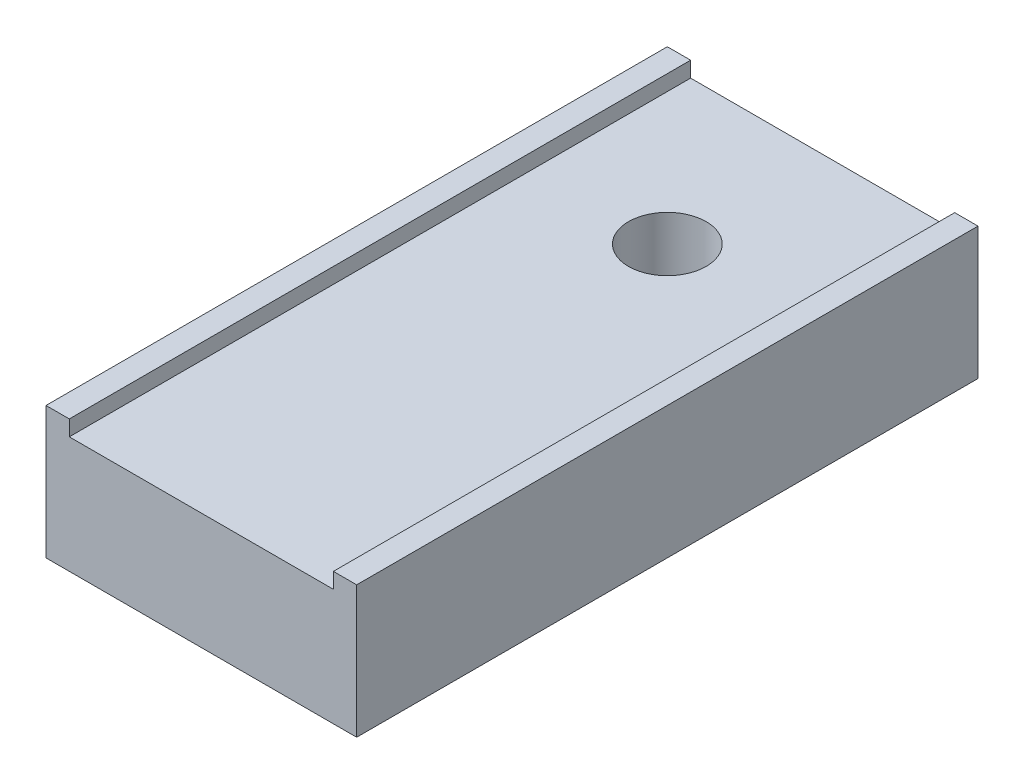
ISO-10303-21;
HEADER;
FILE_DESCRIPTION(('STEP AP214'),'2;1');
FILE_NAME('part.step','',(''),(''),'','','');
FILE_SCHEMA(('AUTOMOTIVE_DESIGN { 1 0 10303 214 1 1 1 1 }'));
ENDSEC;
DATA;
#1=APPLICATION_CONTEXT('core data for automotive mechanical design processes');
#2=APPLICATION_PROTOCOL_DEFINITION('international standard','automotive_design',2000,#1);
#3=PRODUCT_CONTEXT('',#1,'mechanical');
#4=PRODUCT('Part','Part','',(#3));
#5=PRODUCT_RELATED_PRODUCT_CATEGORY('part','',(#4));
#6=PRODUCT_DEFINITION_FORMATION('','',#4);
#7=PRODUCT_DEFINITION_CONTEXT('part definition',#1,'design');
#8=PRODUCT_DEFINITION('design','',#6,#7);
#9=PRODUCT_DEFINITION_SHAPE('','',#8);
#10=(LENGTH_UNIT() NAMED_UNIT(*) SI_UNIT(.MILLI.,.METRE.));
#11=(NAMED_UNIT(*) PLANE_ANGLE_UNIT() SI_UNIT($,.RADIAN.));
#12=(NAMED_UNIT(*) SI_UNIT($,.STERADIAN.) SOLID_ANGLE_UNIT());
#13=UNCERTAINTY_MEASURE_WITH_UNIT(LENGTH_MEASURE(1.E-05),#10,'distance_accuracy_value','');
#14=(GEOMETRIC_REPRESENTATION_CONTEXT(3) GLOBAL_UNCERTAINTY_ASSIGNED_CONTEXT((#13)) GLOBAL_UNIT_ASSIGNED_CONTEXT((#10,
#11,#12)) REPRESENTATION_CONTEXT('',''));
#15=CARTESIAN_POINT('',(0.,0.,0.));
#16=DIRECTION('',(0.,0.,1.));
#17=DIRECTION('',(1.,0.,0.));
#18=AXIS2_PLACEMENT_3D('',#15,#16,#17);
#19=CARTESIAN_POINT('',(0.,9.525,0.));
#20=DIRECTION('',(0.,-1.,0.));
#21=DIRECTION('',(0.,0.,-1.));
#22=AXIS2_PLACEMENT_3D('',#19,#20,#21);
#23=PLANE('',#22);
#24=CARTESIAN_POINT('',(0.,9.525,-12.7));
#25=DIRECTION('',(0.,-1.,0.));
#26=DIRECTION('',(0.,0.,-1.));
#27=AXIS2_PLACEMENT_3D('',#24,#25,#26);
#28=CIRCLE('',#27,3.175);
#29=CARTESIAN_POINT('',(0.,9.525,-9.52500000000001));
#30=VERTEX_POINT('',#29);
#31=EDGE_CURVE('E203',#30,#30,#28,.T.);
#32=ORIENTED_EDGE('',*,*,#31,.T.);
#33=EDGE_LOOP('',(#32));
#34=FACE_BOUND('',#33,.T.);
#35=DIRECTION('',(0.,0.,1.));
#36=VECTOR('',#35,1.);
#37=CARTESIAN_POINT('',(10.795,9.525,-25.4));
#38=LINE('',#37,#36);
#39=CARTESIAN_POINT('',(10.795,9.525,-25.4));
#40=VERTEX_POINT('',#39);
#41=CARTESIAN_POINT('',(10.795,9.525,25.4));
#42=VERTEX_POINT('',#41);
#43=EDGE_CURVE('E61',#40,#42,#38,.T.);
#44=ORIENTED_EDGE('',*,*,#43,.F.);
#45=DIRECTION('',(-1.,0.,0.));
#46=VECTOR('',#45,1.);
#47=CARTESIAN_POINT('',(-12.7,9.525,-25.4));
#48=LINE('',#47,#46);
#49=CARTESIAN_POINT('',(-10.795,9.525,-25.4));
#50=VERTEX_POINT('',#49);
#51=EDGE_CURVE('E171',#40,#50,#48,.T.);
#52=ORIENTED_EDGE('',*,*,#51,.T.);
#53=DIRECTION('',(0.,0.,-1.));
#54=VECTOR('',#53,1.);
#55=CARTESIAN_POINT('',(-10.795,9.525,-25.4));
#56=LINE('',#55,#54);
#57=CARTESIAN_POINT('',(-10.795,9.525,25.4));
#58=VERTEX_POINT('',#57);
#59=EDGE_CURVE('E140',#58,#50,#56,.T.);
#60=ORIENTED_EDGE('',*,*,#59,.F.);
#61=DIRECTION('',(1.,0.,0.));
#62=VECTOR('',#61,1.);
#63=CARTESIAN_POINT('',(-12.7,9.525,25.4));
#64=LINE('',#63,#62);
#65=EDGE_CURVE('E66',#58,#42,#64,.T.);
#66=ORIENTED_EDGE('',*,*,#65,.T.);
#67=EDGE_LOOP('',(#44,#52,#60,#66));
#68=FACE_BOUND('',#67,.T.);
#69=ADVANCED_FACE('F45',(#34,#68),#23,.F.);
#70=CARTESIAN_POINT('',(12.7,9.525,25.4));
#71=DIRECTION('',(-1.,0.,0.));
#72=DIRECTION('',(0.,0.,1.));
#73=AXIS2_PLACEMENT_3D('',#70,#71,#72);
#74=PLANE('',#73);
#75=DIRECTION('',(0.,0.,-1.));
#76=VECTOR('',#75,1.);
#77=CARTESIAN_POINT('',(12.7,0.,25.4));
#78=LINE('',#77,#76);
#79=CARTESIAN_POINT('',(12.7,0.,25.4));
#80=VERTEX_POINT('',#79);
#81=CARTESIAN_POINT('',(12.7,0.,-25.4));
#82=VERTEX_POINT('',#81);
#83=EDGE_CURVE('E170',#80,#82,#78,.T.);
#84=ORIENTED_EDGE('',*,*,#83,.T.);
#85=DIRECTION('',(0.,-1.,0.));
#86=VECTOR('',#85,1.);
#87=CARTESIAN_POINT('',(12.7,9.525,-25.4));
#88=LINE('',#87,#86);
#89=CARTESIAN_POINT('',(12.7,10.795,-25.4));
#90=VERTEX_POINT('',#89);
#91=EDGE_CURVE('E11',#90,#82,#88,.T.);
#92=ORIENTED_EDGE('',*,*,#91,.F.);
#93=DIRECTION('',(0.,0.,-1.));
#94=VECTOR('',#93,1.);
#95=CARTESIAN_POINT('',(12.7,10.795,-25.4));
#96=LINE('',#95,#94);
#97=CARTESIAN_POINT('',(12.7,10.795,25.4));
#98=VERTEX_POINT('',#97);
#99=EDGE_CURVE('E127',#98,#90,#96,.T.);
#100=ORIENTED_EDGE('',*,*,#99,.F.);
#101=DIRECTION('',(0.,-1.,0.));
#102=VECTOR('',#101,1.);
#103=CARTESIAN_POINT('',(12.7,9.525,25.4));
#104=LINE('',#103,#102);
#105=EDGE_CURVE('E109',#98,#80,#104,.T.);
#106=ORIENTED_EDGE('',*,*,#105,.T.);
#107=EDGE_LOOP('',(#84,#92,#100,#106));
#108=FACE_BOUND('',#107,.T.);
#109=ADVANCED_FACE('F47',(#108),#74,.F.);
#110=CARTESIAN_POINT('',(-12.7,9.525,-25.4));
#111=DIRECTION('',(0.,0.,1.));
#112=DIRECTION('',(1.,0.,0.));
#113=AXIS2_PLACEMENT_3D('',#110,#111,#112);
#114=PLANE('',#113);
#115=DIRECTION('',(-1.,0.,0.));
#116=VECTOR('',#115,1.);
#117=CARTESIAN_POINT('',(-12.7,0.,-25.4));
#118=LINE('',#117,#116);
#119=CARTESIAN_POINT('',(-12.7,0.,-25.4));
#120=VERTEX_POINT('',#119);
#121=EDGE_CURVE('E178',#82,#120,#118,.T.);
#122=ORIENTED_EDGE('',*,*,#121,.T.);
#123=DIRECTION('',(0.,-1.,0.));
#124=VECTOR('',#123,1.);
#125=CARTESIAN_POINT('',(-12.7,9.525,-25.4));
#126=LINE('',#125,#124);
#127=CARTESIAN_POINT('',(-12.7,10.795,-25.4));
#128=VERTEX_POINT('',#127);
#129=EDGE_CURVE('E54',#128,#120,#126,.T.);
#130=ORIENTED_EDGE('',*,*,#129,.F.);
#131=DIRECTION('',(-1.,0.,0.));
#132=VECTOR('',#131,1.);
#133=CARTESIAN_POINT('',(-12.7,10.795,-25.4));
#134=LINE('',#133,#132);
#135=CARTESIAN_POINT('',(-10.795,10.795,-25.4));
#136=VERTEX_POINT('',#135);
#137=EDGE_CURVE('E155',#136,#128,#134,.T.);
#138=ORIENTED_EDGE('',*,*,#137,.F.);
#139=DIRECTION('',(0.,-1.,0.));
#140=VECTOR('',#139,1.);
#141=CARTESIAN_POINT('',(-10.795,10.795,-25.4));
#142=LINE('',#141,#140);
#143=EDGE_CURVE('E159',#136,#50,#142,.T.);
#144=ORIENTED_EDGE('',*,*,#143,.T.);
#145=ORIENTED_EDGE('',*,*,#51,.F.);
#146=DIRECTION('',(0.,-1.,0.));
#147=VECTOR('',#146,1.);
#148=CARTESIAN_POINT('',(10.795,10.795,-25.4));
#149=LINE('',#148,#147);
#150=CARTESIAN_POINT('',(10.795,10.795,-25.4));
#151=VERTEX_POINT('',#150);
#152=EDGE_CURVE('E200',#151,#40,#149,.T.);
#153=ORIENTED_EDGE('',*,*,#152,.F.);
#154=DIRECTION('',(-1.,0.,0.));
#155=VECTOR('',#154,1.);
#156=CARTESIAN_POINT('',(12.7,10.795,-25.4));
#157=LINE('',#156,#155);
#158=EDGE_CURVE('E136',#90,#151,#157,.T.);
#159=ORIENTED_EDGE('',*,*,#158,.F.);
#160=ORIENTED_EDGE('',*,*,#91,.T.);
#161=EDGE_LOOP('',(#122,#130,#138,#144,#145,#153,#159,#160));
#162=FACE_BOUND('',#161,.T.);
#163=ADVANCED_FACE('F197',(#162),#114,.F.);
#164=CARTESIAN_POINT('',(-12.7,9.525,25.4));
#165=DIRECTION('',(1.,0.,0.));
#166=DIRECTION('',(0.,0.,-1.));
#167=AXIS2_PLACEMENT_3D('',#164,#165,#166);
#168=PLANE('',#167);
#169=DIRECTION('',(0.,0.,1.));
#170=VECTOR('',#169,1.);
#171=CARTESIAN_POINT('',(-12.7,0.,25.4));
#172=LINE('',#171,#170);
#173=CARTESIAN_POINT('',(-12.7,0.,25.4));
#174=VERTEX_POINT('',#173);
#175=EDGE_CURVE('E181',#120,#174,#172,.T.);
#176=ORIENTED_EDGE('',*,*,#175,.T.);
#177=DIRECTION('',(0.,-1.,0.));
#178=VECTOR('',#177,1.);
#179=CARTESIAN_POINT('',(-12.7,9.525,25.4));
#180=LINE('',#179,#178);
#181=CARTESIAN_POINT('',(-12.7,10.795,25.4));
#182=VERTEX_POINT('',#181);
#183=EDGE_CURVE('E122',#182,#174,#180,.T.);
#184=ORIENTED_EDGE('',*,*,#183,.F.);
#185=DIRECTION('',(0.,0.,1.));
#186=VECTOR('',#185,1.);
#187=CARTESIAN_POINT('',(-12.7,10.795,-25.4));
#188=LINE('',#187,#186);
#189=EDGE_CURVE('E145',#128,#182,#188,.T.);
#190=ORIENTED_EDGE('',*,*,#189,.F.);
#191=ORIENTED_EDGE('',*,*,#129,.T.);
#192=EDGE_LOOP('',(#176,#184,#190,#191));
#193=FACE_BOUND('',#192,.T.);
#194=ADVANCED_FACE('F192',(#193),#168,.F.);
#195=CARTESIAN_POINT('',(-12.7,9.525,25.4));
#196=DIRECTION('',(0.,0.,-1.));
#197=DIRECTION('',(-1.,0.,0.));
#198=AXIS2_PLACEMENT_3D('',#195,#196,#197);
#199=PLANE('',#198);
#200=DIRECTION('',(1.,0.,0.));
#201=VECTOR('',#200,1.);
#202=CARTESIAN_POINT('',(-12.7,0.,25.4));
#203=LINE('',#202,#201);
#204=EDGE_CURVE('E116',#174,#80,#203,.T.);
#205=ORIENTED_EDGE('',*,*,#204,.T.);
#206=ORIENTED_EDGE('',*,*,#105,.F.);
#207=DIRECTION('',(1.,0.,0.));
#208=VECTOR('',#207,1.);
#209=CARTESIAN_POINT('',(12.7,10.795,25.4));
#210=LINE('',#209,#208);
#211=CARTESIAN_POINT('',(10.795,10.795,25.4));
#212=VERTEX_POINT('',#211);
#213=EDGE_CURVE('E113',#212,#98,#210,.T.);
#214=ORIENTED_EDGE('',*,*,#213,.F.);
#215=DIRECTION('',(0.,-1.,0.));
#216=VECTOR('',#215,1.);
#217=CARTESIAN_POINT('',(10.795,10.795,25.4));
#218=LINE('',#217,#216);
#219=EDGE_CURVE('E132',#212,#42,#218,.T.);
#220=ORIENTED_EDGE('',*,*,#219,.T.);
#221=ORIENTED_EDGE('',*,*,#65,.F.);
#222=DIRECTION('',(0.,-1.,0.));
#223=VECTOR('',#222,1.);
#224=CARTESIAN_POINT('',(-10.795,10.795,25.4));
#225=LINE('',#224,#223);
#226=CARTESIAN_POINT('',(-10.795,10.795,25.4));
#227=VERTEX_POINT('',#226);
#228=EDGE_CURVE('E166',#227,#58,#225,.T.);
#229=ORIENTED_EDGE('',*,*,#228,.F.);
#230=DIRECTION('',(1.,0.,0.));
#231=VECTOR('',#230,1.);
#232=CARTESIAN_POINT('',(-12.7,10.795,25.4));
#233=LINE('',#232,#231);
#234=EDGE_CURVE('E149',#182,#227,#233,.T.);
#235=ORIENTED_EDGE('',*,*,#234,.F.);
#236=ORIENTED_EDGE('',*,*,#183,.T.);
#237=EDGE_LOOP('',(#205,#206,#214,#220,#221,#229,#235,#236));
#238=FACE_BOUND('',#237,.T.);
#239=ADVANCED_FACE('F111',(#238),#199,.F.);
#240=CARTESIAN_POINT('',(0.,0.,0.));
#241=DIRECTION('',(0.,-1.,0.));
#242=DIRECTION('',(0.,0.,-1.));
#243=AXIS2_PLACEMENT_3D('',#240,#241,#242);
#244=PLANE('',#243);
#245=CARTESIAN_POINT('',(0.,0.,-12.7));
#246=DIRECTION('',(0.,1.,0.));
#247=DIRECTION('',(0.,0.,1.));
#248=AXIS2_PLACEMENT_3D('',#245,#246,#247);
#249=CIRCLE('',#248,3.175);
#250=CARTESIAN_POINT('',(0.,0.,-9.52500000000001));
#251=VERTEX_POINT('',#250);
#252=EDGE_CURVE('E213',#251,#251,#249,.T.);
#253=ORIENTED_EDGE('',*,*,#252,.T.);
#254=EDGE_LOOP('',(#253));
#255=FACE_BOUND('',#254,.T.);
#256=ORIENTED_EDGE('',*,*,#83,.F.);
#257=ORIENTED_EDGE('',*,*,#204,.F.);
#258=ORIENTED_EDGE('',*,*,#175,.F.);
#259=ORIENTED_EDGE('',*,*,#121,.F.);
#260=EDGE_LOOP('',(#256,#257,#258,#259));
#261=FACE_BOUND('',#260,.T.);
#262=ADVANCED_FACE('F196',(#255,#261),#244,.T.);
#263=CARTESIAN_POINT('',(-10.795,10.795,-25.4));
#264=DIRECTION('',(-1.,0.,0.));
#265=DIRECTION('',(0.,0.,1.));
#266=AXIS2_PLACEMENT_3D('',#263,#264,#265);
#267=PLANE('',#266);
#268=ORIENTED_EDGE('',*,*,#59,.T.);
#269=ORIENTED_EDGE('',*,*,#143,.F.);
#270=DIRECTION('',(0.,0.,-1.));
#271=VECTOR('',#270,1.);
#272=CARTESIAN_POINT('',(-10.795,10.795,-25.4));
#273=LINE('',#272,#271);
#274=EDGE_CURVE('E152',#227,#136,#273,.T.);
#275=ORIENTED_EDGE('',*,*,#274,.F.);
#276=ORIENTED_EDGE('',*,*,#228,.T.);
#277=EDGE_LOOP('',(#268,#269,#275,#276));
#278=FACE_BOUND('',#277,.T.);
#279=ADVANCED_FACE('F234',(#278),#267,.F.);
#280=CARTESIAN_POINT('',(0.,10.795,0.));
#281=DIRECTION('',(0.,1.,0.));
#282=DIRECTION('',(0.,0.,1.));
#283=AXIS2_PLACEMENT_3D('',#280,#281,#282);
#284=PLANE('',#283);
#285=ORIENTED_EDGE('',*,*,#189,.T.);
#286=ORIENTED_EDGE('',*,*,#234,.T.);
#287=ORIENTED_EDGE('',*,*,#274,.T.);
#288=ORIENTED_EDGE('',*,*,#137,.T.);
#289=EDGE_LOOP('',(#285,#286,#287,#288));
#290=FACE_BOUND('',#289,.T.);
#291=ADVANCED_FACE('F262',(#290),#284,.T.);
#292=CARTESIAN_POINT('',(10.795,10.795,-25.4));
#293=DIRECTION('',(1.,0.,0.));
#294=DIRECTION('',(0.,0.,-1.));
#295=AXIS2_PLACEMENT_3D('',#292,#293,#294);
#296=PLANE('',#295);
#297=ORIENTED_EDGE('',*,*,#43,.T.);
#298=ORIENTED_EDGE('',*,*,#219,.F.);
#299=DIRECTION('',(0.,0.,1.));
#300=VECTOR('',#299,1.);
#301=CARTESIAN_POINT('',(10.795,10.795,-25.4));
#302=LINE('',#301,#300);
#303=EDGE_CURVE('E129',#151,#212,#302,.T.);
#304=ORIENTED_EDGE('',*,*,#303,.F.);
#305=ORIENTED_EDGE('',*,*,#152,.T.);
#306=EDGE_LOOP('',(#297,#298,#304,#305));
#307=FACE_BOUND('',#306,.T.);
#308=ADVANCED_FACE('F205',(#307),#296,.F.);
#309=CARTESIAN_POINT('',(0.,10.795,0.));
#310=DIRECTION('',(0.,-1.,0.));
#311=DIRECTION('',(0.,0.,-1.));
#312=AXIS2_PLACEMENT_3D('',#309,#310,#311);
#313=PLANE('',#312);
#314=ORIENTED_EDGE('',*,*,#99,.T.);
#315=ORIENTED_EDGE('',*,*,#158,.T.);
#316=ORIENTED_EDGE('',*,*,#303,.T.);
#317=ORIENTED_EDGE('',*,*,#213,.T.);
#318=EDGE_LOOP('',(#314,#315,#316,#317));
#319=FACE_BOUND('',#318,.T.);
#320=ADVANCED_FACE('F126',(#319),#313,.F.);
#321=CARTESIAN_POINT('',(0.,0.,-12.7));
#322=DIRECTION('',(0.,1.,0.));
#323=DIRECTION('',(0.,0.,1.));
#324=AXIS2_PLACEMENT_3D('',#321,#322,#323);
#325=CYLINDRICAL_SURFACE('',#324,3.175);
#326=CARTESIAN_POINT('',(0.,0.,-9.52500000000001));
#327=CARTESIAN_POINT('',(0.,0.0992187499999999,-9.52500000000001));
#328=CARTESIAN_POINT('',(0.,0.1984375,-9.52500000000001));
#329=CARTESIAN_POINT('',(0.,0.396875,-9.52500000000001));
#330=CARTESIAN_POINT('',(0.,0.49609375,-9.52500000000001));
#331=CARTESIAN_POINT('',(0.,0.69453125,-9.52500000000001));
#332=CARTESIAN_POINT('',(0.,0.79375,-9.52500000000001));
#333=CARTESIAN_POINT('',(0.,0.9921875,-9.52500000000001));
#334=CARTESIAN_POINT('',(0.,1.09140625,-9.52500000000001));
#335=CARTESIAN_POINT('',(0.,1.28984375,-9.52500000000001));
#336=CARTESIAN_POINT('',(0.,1.3890625,-9.52500000000001));
#337=CARTESIAN_POINT('',(0.,1.5875,-9.52500000000001));
#338=CARTESIAN_POINT('',(0.,1.68671875,-9.52500000000001));
#339=CARTESIAN_POINT('',(0.,1.88515625,-9.52500000000001));
#340=CARTESIAN_POINT('',(0.,1.984375,-9.52500000000001));
#341=CARTESIAN_POINT('',(0.,2.1828125,-9.52500000000001));
#342=CARTESIAN_POINT('',(0.,2.28203125,-9.52500000000001));
#343=CARTESIAN_POINT('',(0.,2.48046875,-9.52500000000001));
#344=CARTESIAN_POINT('',(0.,2.5796875,-9.52500000000001));
#345=CARTESIAN_POINT('',(0.,2.778125,-9.52500000000001));
#346=CARTESIAN_POINT('',(0.,2.87734375,-9.52500000000001));
#347=CARTESIAN_POINT('',(0.,3.07578125,-9.52500000000001));
#348=CARTESIAN_POINT('',(0.,3.175,-9.52500000000001));
#349=CARTESIAN_POINT('',(0.,3.3734375,-9.52500000000001));
#350=CARTESIAN_POINT('',(0.,3.47265625,-9.52500000000001));
#351=CARTESIAN_POINT('',(0.,3.67109375,-9.52500000000001));
#352=CARTESIAN_POINT('',(0.,3.7703125,-9.52500000000001));
#353=CARTESIAN_POINT('',(0.,3.96875,-9.52500000000001));
#354=CARTESIAN_POINT('',(0.,4.06796875,-9.52500000000001));
#355=CARTESIAN_POINT('',(0.,4.26640625,-9.52500000000001));
#356=CARTESIAN_POINT('',(0.,4.365625,-9.52500000000001));
#357=CARTESIAN_POINT('',(0.,4.5640625,-9.52500000000001));
#358=CARTESIAN_POINT('',(0.,4.66328125,-9.52500000000001));
#359=CARTESIAN_POINT('',(0.,4.86171875,-9.52500000000001));
#360=CARTESIAN_POINT('',(0.,4.9609375,-9.52500000000001));
#361=CARTESIAN_POINT('',(0.,5.159375,-9.52500000000001));
#362=CARTESIAN_POINT('',(0.,5.25859375,-9.52500000000001));
#363=CARTESIAN_POINT('',(0.,5.45703125,-9.52500000000001));
#364=CARTESIAN_POINT('',(0.,5.55625,-9.52500000000001));
#365=CARTESIAN_POINT('',(0.,5.7546875,-9.52500000000001));
#366=CARTESIAN_POINT('',(0.,5.85390625,-9.52500000000001));
#367=CARTESIAN_POINT('',(0.,6.05234375,-9.52500000000001));
#368=CARTESIAN_POINT('',(0.,6.1515625,-9.52500000000001));
#369=CARTESIAN_POINT('',(0.,6.35,-9.52500000000001));
#370=CARTESIAN_POINT('',(0.,6.44921875,-9.52500000000001));
#371=CARTESIAN_POINT('',(0.,6.64765625,-9.52500000000001));
#372=CARTESIAN_POINT('',(0.,6.746875,-9.52500000000001));
#373=CARTESIAN_POINT('',(0.,6.9453125,-9.52500000000001));
#374=CARTESIAN_POINT('',(0.,7.04453125,-9.52500000000001));
#375=CARTESIAN_POINT('',(0.,7.24296875,-9.52500000000001));
#376=CARTESIAN_POINT('',(0.,7.3421875,-9.52500000000001));
#377=CARTESIAN_POINT('',(0.,7.540625,-9.52500000000001));
#378=CARTESIAN_POINT('',(0.,7.63984375,-9.52500000000001));
#379=CARTESIAN_POINT('',(0.,7.83828125,-9.52500000000001));
#380=CARTESIAN_POINT('',(0.,7.9375,-9.52500000000001));
#381=CARTESIAN_POINT('',(0.,8.1359375,-9.52500000000001));
#382=CARTESIAN_POINT('',(0.,8.23515625,-9.52500000000001));
#383=CARTESIAN_POINT('',(0.,8.43359375,-9.52500000000001));
#384=CARTESIAN_POINT('',(0.,8.5328125,-9.52500000000001));
#385=CARTESIAN_POINT('',(0.,8.73125,-9.52500000000001));
#386=CARTESIAN_POINT('',(0.,8.83046875,-9.52500000000001));
#387=CARTESIAN_POINT('',(0.,9.02890625,-9.52500000000001));
#388=CARTESIAN_POINT('',(0.,9.128125,-9.52500000000001));
#389=CARTESIAN_POINT('',(0.,9.3265625,-9.52500000000001));
#390=CARTESIAN_POINT('',(0.,9.42578125,-9.52500000000001));
#391=CARTESIAN_POINT('',(0.,9.525,-9.52500000000001));
#392=B_SPLINE_CURVE_WITH_KNOTS('',3,(#326,#327,#328,#329,#330,#331,#332,#333,#334,#335,#336,
#337,#338,#339,#340,#341,#342,#343,#344,#345,#346,#347,#348,#349,#350,#351,#352,#353,#354,#355,
#356,#357,#358,#359,#360,#361,#362,#363,#364,#365,#366,#367,#368,#369,#370,#371,#372,#373,#374,
#375,#376,#377,#378,#379,#380,#381,#382,#383,#384,#385,#386,#387,#388,#389,#390,#391),
.UNSPECIFIED.,.F.,.F.,(4,2,2,2,2,2,2,2,2,2,2,2,2,2,2,2,2,2,2,2,2,2,2,2,2,2,2,2,2,2,2,2,4),(0.,
0.29765625,0.5953125,0.89296875,1.190625,1.48828125,1.7859375,2.08359375,2.38125,2.67890625,
2.9765625,3.27421875,3.571875,3.86953125,4.1671875,4.46484375,4.7625,5.06015625,5.3578125,
5.65546875,5.953125,6.25078125,6.5484375,6.84609375,7.14375,7.44140625,7.7390625,8.03671875,
8.334375,8.63203125,8.9296875,9.22734375,9.525),.UNSPECIFIED.);
#393=EDGE_CURVE('BSEAM219',#251,#30,#392,.T.);
#394=ORIENTED_EDGE('',*,*,#252,.F.);
#395=ORIENTED_EDGE('',*,*,#31,.F.);
#396=ORIENTED_EDGE('',*,*,#393,.T.);
#397=ORIENTED_EDGE('',*,*,#393,.F.);
#398=EDGE_LOOP('',(#394,#396,#395,#397));
#399=FACE_BOUND('',#398,.T.);
#400=ADVANCED_FACE('F219',(#399),#325,.F.);
#401=CLOSED_SHELL('',(#69,#109,#163,#194,#239,#262,#279,#291,#308,#320,#400));
#402=MANIFOLD_SOLID_BREP('B2',#401);
#403=ADVANCED_BREP_SHAPE_REPRESENTATION('',(#18,#402),#14);
#404=SHAPE_DEFINITION_REPRESENTATION(#9,#403);
ENDSEC;
END-ISO-10303-21;
